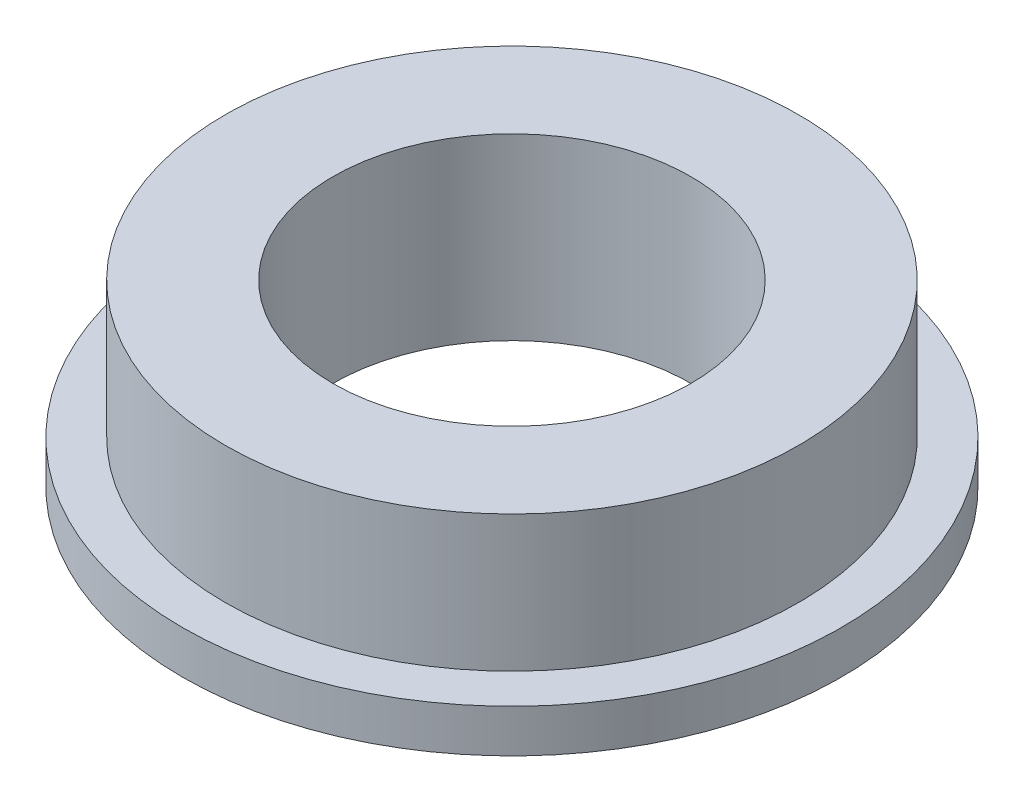
ISO-10303-21;
HEADER;
FILE_DESCRIPTION(('STEP AP214'),'2;1');
FILE_NAME('part.step','',(''),(''),'','','');
FILE_SCHEMA(('AUTOMOTIVE_DESIGN { 1 0 10303 214 1 1 1 1 }'));
ENDSEC;
DATA;
#1=APPLICATION_CONTEXT('core data for automotive mechanical design processes');
#2=APPLICATION_PROTOCOL_DEFINITION('international standard','automotive_design',2000,#1);
#3=PRODUCT_CONTEXT('',#1,'mechanical');
#4=PRODUCT('Part','Part','',(#3));
#5=PRODUCT_RELATED_PRODUCT_CATEGORY('part','',(#4));
#6=PRODUCT_DEFINITION_FORMATION('','',#4);
#7=PRODUCT_DEFINITION_CONTEXT('part definition',#1,'design');
#8=PRODUCT_DEFINITION('design','',#6,#7);
#9=PRODUCT_DEFINITION_SHAPE('','',#8);
#10=(LENGTH_UNIT() NAMED_UNIT(*) SI_UNIT(.MILLI.,.METRE.));
#11=(NAMED_UNIT(*) PLANE_ANGLE_UNIT() SI_UNIT($,.RADIAN.));
#12=(NAMED_UNIT(*) SI_UNIT($,.STERADIAN.) SOLID_ANGLE_UNIT());
#13=UNCERTAINTY_MEASURE_WITH_UNIT(LENGTH_MEASURE(1.E-05),#10,'distance_accuracy_value','');
#14=(GEOMETRIC_REPRESENTATION_CONTEXT(3) GLOBAL_UNCERTAINTY_ASSIGNED_CONTEXT((#13)) GLOBAL_UNIT_ASSIGNED_CONTEXT((#10,
#11,#12)) REPRESENTATION_CONTEXT('',''));
#15=CARTESIAN_POINT('',(0.,0.,0.));
#16=DIRECTION('',(0.,0.,1.));
#17=DIRECTION('',(1.,0.,0.));
#18=AXIS2_PLACEMENT_3D('',#15,#16,#17);
#19=CARTESIAN_POINT('',(0.,0.6,0.));
#20=DIRECTION('',(0.,1.,0.));
#21=DIRECTION('',(0.,0.,1.));
#22=AXIS2_PLACEMENT_3D('',#19,#20,#21);
#23=PLANE('',#22);
#24=CARTESIAN_POINT('',(0.,0.6,0.));
#25=DIRECTION('',(0.,1.,0.));
#26=DIRECTION('',(0.,0.,1.));
#27=AXIS2_PLACEMENT_3D('',#24,#25,#26);
#28=CIRCLE('',#27,4.6);
#29=CARTESIAN_POINT('',(0.,0.6,4.6));
#30=VERTEX_POINT('',#29);
#31=EDGE_CURVE('E10',#30,#30,#28,.T.);
#32=ORIENTED_EDGE('',*,*,#31,.T.);
#33=EDGE_LOOP('',(#32));
#34=FACE_BOUND('',#33,.T.);
#35=CARTESIAN_POINT('',(0.,0.6,0.));
#36=DIRECTION('',(0.,1.,0.));
#37=DIRECTION('',(0.,0.,1.));
#38=AXIS2_PLACEMENT_3D('',#35,#36,#37);
#39=CIRCLE('',#38,4.);
#40=CARTESIAN_POINT('',(0.,0.6,4.));
#41=VERTEX_POINT('',#40);
#42=EDGE_CURVE('E46',#41,#41,#39,.F.);
#43=ORIENTED_EDGE('',*,*,#42,.T.);
#44=EDGE_LOOP('',(#43));
#45=FACE_BOUND('',#44,.T.);
#46=ADVANCED_FACE('F31',(#34,#45),#23,.T.);
#47=CARTESIAN_POINT('',(0.,0.,0.));
#48=DIRECTION('',(0.,1.,0.));
#49=DIRECTION('',(0.,0.,1.));
#50=AXIS2_PLACEMENT_3D('',#47,#48,#49);
#51=PLANE('',#50);
#52=CARTESIAN_POINT('',(0.,0.,0.));
#53=DIRECTION('',(0.,1.,0.));
#54=DIRECTION('',(0.,0.,1.));
#55=AXIS2_PLACEMENT_3D('',#52,#53,#54);
#56=CIRCLE('',#55,2.5);
#57=CARTESIAN_POINT('',(0.,0.,2.5));
#58=VERTEX_POINT('',#57);
#59=EDGE_CURVE('E42',#58,#58,#56,.T.);
#60=ORIENTED_EDGE('',*,*,#59,.T.);
#61=EDGE_LOOP('',(#60));
#62=FACE_BOUND('',#61,.T.);
#63=CARTESIAN_POINT('',(0.,0.,0.));
#64=DIRECTION('',(0.,1.,0.));
#65=DIRECTION('',(0.,0.,1.));
#66=AXIS2_PLACEMENT_3D('',#63,#64,#65);
#67=CIRCLE('',#66,4.6);
#68=CARTESIAN_POINT('',(0.,0.,4.6));
#69=VERTEX_POINT('',#68);
#70=EDGE_CURVE('E35',#69,#69,#67,.T.);
#71=ORIENTED_EDGE('',*,*,#70,.F.);
#72=EDGE_LOOP('',(#71));
#73=FACE_BOUND('',#72,.T.);
#74=ADVANCED_FACE('F72',(#62,#73),#51,.F.);
#75=CARTESIAN_POINT('',(0.,0.6,0.));
#76=DIRECTION('',(0.,-1.,0.));
#77=DIRECTION('',(0.,0.,-1.));
#78=AXIS2_PLACEMENT_3D('',#75,#76,#77);
#79=CYLINDRICAL_SURFACE('',#78,4.6);
#80=ORIENTED_EDGE('',*,*,#31,.F.);
#81=EDGE_LOOP('',(#80));
#82=FACE_BOUND('',#81,.T.);
#83=ORIENTED_EDGE('',*,*,#70,.T.);
#84=EDGE_LOOP('',(#83));
#85=FACE_BOUND('',#84,.T.);
#86=ADVANCED_FACE('F33',(#82,#85),#79,.T.);
#87=CARTESIAN_POINT('',(0.,0.6,0.));
#88=DIRECTION('',(0.,-1.,0.));
#89=DIRECTION('',(0.,0.,-1.));
#90=AXIS2_PLACEMENT_3D('',#87,#88,#89);
#91=CYLINDRICAL_SURFACE('',#90,2.5);
#92=ORIENTED_EDGE('',*,*,#59,.F.);
#93=EDGE_LOOP('',(#92));
#94=FACE_BOUND('',#93,.T.);
#95=CARTESIAN_POINT('',(0.,2.5,0.));
#96=DIRECTION('',(0.,1.,0.));
#97=DIRECTION('',(0.,0.,1.));
#98=AXIS2_PLACEMENT_3D('',#95,#96,#97);
#99=CIRCLE('',#98,2.5);
#100=CARTESIAN_POINT('',(0.,2.5,2.5));
#101=VERTEX_POINT('',#100);
#102=EDGE_CURVE('E52',#101,#101,#99,.T.);
#103=ORIENTED_EDGE('',*,*,#102,.T.);
#104=EDGE_LOOP('',(#103));
#105=FACE_BOUND('',#104,.T.);
#106=ADVANCED_FACE('F56',(#94,#105),#91,.F.);
#107=CARTESIAN_POINT('',(0.,2.5,0.));
#108=DIRECTION('',(0.,1.,0.));
#109=DIRECTION('',(0.,0.,1.));
#110=AXIS2_PLACEMENT_3D('',#107,#108,#109);
#111=PLANE('',#110);
#112=CARTESIAN_POINT('',(0.,2.5,0.));
#113=DIRECTION('',(0.,1.,0.));
#114=DIRECTION('',(0.,0.,1.));
#115=AXIS2_PLACEMENT_3D('',#112,#113,#114);
#116=CIRCLE('',#115,4.);
#117=CARTESIAN_POINT('',(0.,2.5,4.));
#118=VERTEX_POINT('',#117);
#119=EDGE_CURVE('E49',#118,#118,#116,.T.);
#120=ORIENTED_EDGE('',*,*,#119,.T.);
#121=EDGE_LOOP('',(#120));
#122=FACE_BOUND('',#121,.T.);
#123=ORIENTED_EDGE('',*,*,#102,.F.);
#124=EDGE_LOOP('',(#123));
#125=FACE_BOUND('',#124,.T.);
#126=ADVANCED_FACE('F58',(#122,#125),#111,.T.);
#127=CARTESIAN_POINT('',(0.,2.5,0.));
#128=DIRECTION('',(0.,-1.,0.));
#129=DIRECTION('',(0.,0.,-1.));
#130=AXIS2_PLACEMENT_3D('',#127,#128,#129);
#131=CYLINDRICAL_SURFACE('',#130,4.);
#132=ORIENTED_EDGE('',*,*,#42,.F.);
#133=EDGE_LOOP('',(#132));
#134=FACE_BOUND('',#133,.T.);
#135=ORIENTED_EDGE('',*,*,#119,.F.);
#136=EDGE_LOOP('',(#135));
#137=FACE_BOUND('',#136,.T.);
#138=ADVANCED_FACE('F60',(#134,#137),#131,.T.);
#139=CLOSED_SHELL('',(#46,#74,#86,#106,#126,#138));
#140=MANIFOLD_SOLID_BREP('B2',#139);
#141=ADVANCED_BREP_SHAPE_REPRESENTATION('',(#18,#140),#14);
#142=SHAPE_DEFINITION_REPRESENTATION(#9,#141);
ENDSEC;
END-ISO-10303-21;
